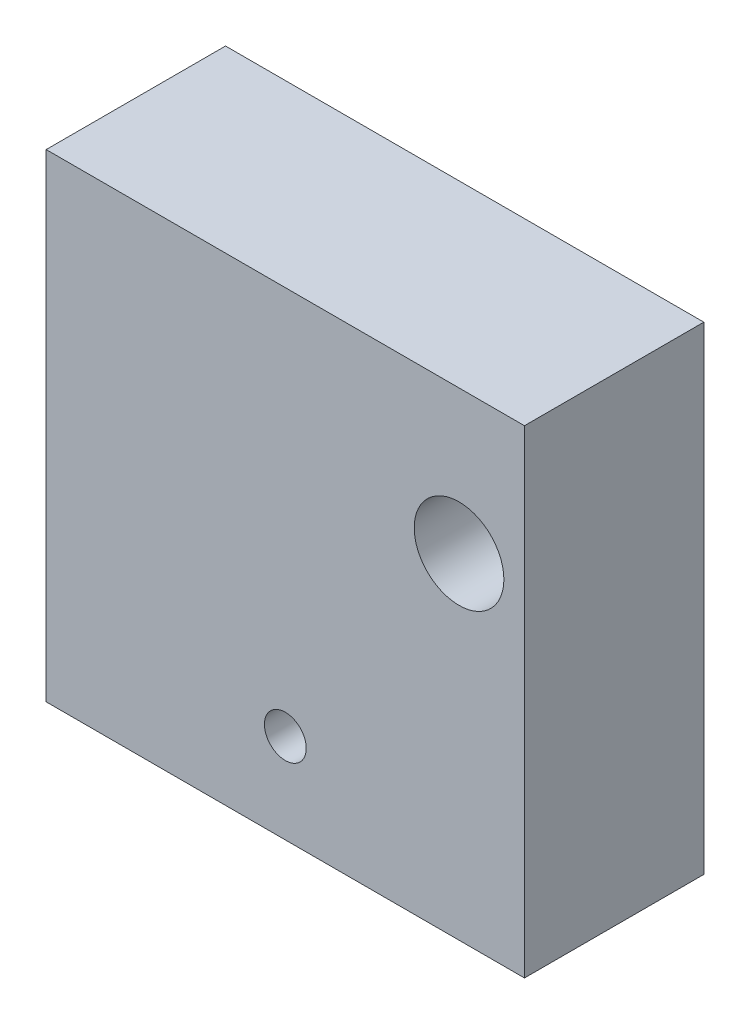
ISO-10303-21;
HEADER;
FILE_DESCRIPTION(('STEP AP214'),'2;1');
FILE_NAME('part.step','',(''),(''),'','','');
FILE_SCHEMA(('AUTOMOTIVE_DESIGN { 1 0 10303 214 1 1 1 1 }'));
ENDSEC;
DATA;
#1=APPLICATION_CONTEXT('core data for automotive mechanical design processes');
#2=APPLICATION_PROTOCOL_DEFINITION('international standard','automotive_design',2000,#1);
#3=PRODUCT_CONTEXT('',#1,'mechanical');
#4=PRODUCT('Part','Part','',(#3));
#5=PRODUCT_RELATED_PRODUCT_CATEGORY('part','',(#4));
#6=PRODUCT_DEFINITION_FORMATION('','',#4);
#7=PRODUCT_DEFINITION_CONTEXT('part definition',#1,'design');
#8=PRODUCT_DEFINITION('design','',#6,#7);
#9=PRODUCT_DEFINITION_SHAPE('','',#8);
#10=(LENGTH_UNIT() NAMED_UNIT(*) SI_UNIT(.MILLI.,.METRE.));
#11=(NAMED_UNIT(*) PLANE_ANGLE_UNIT() SI_UNIT($,.RADIAN.));
#12=(NAMED_UNIT(*) SI_UNIT($,.STERADIAN.) SOLID_ANGLE_UNIT());
#13=UNCERTAINTY_MEASURE_WITH_UNIT(LENGTH_MEASURE(1.E-05),#10,'distance_accuracy_value','');
#14=(GEOMETRIC_REPRESENTATION_CONTEXT(3) GLOBAL_UNCERTAINTY_ASSIGNED_CONTEXT((#13)) GLOBAL_UNIT_ASSIGNED_CONTEXT((#10,
#11,#12)) REPRESENTATION_CONTEXT('',''));
#15=CARTESIAN_POINT('',(0.,0.,0.));
#16=DIRECTION('',(0.,0.,1.));
#17=DIRECTION('',(1.,0.,0.));
#18=AXIS2_PLACEMENT_3D('',#15,#16,#17);
#19=CARTESIAN_POINT('',(40.,-40.,30.));
#20=DIRECTION('',(-1.,0.,0.));
#21=DIRECTION('',(0.,0.,1.));
#22=AXIS2_PLACEMENT_3D('',#19,#20,#21);
#23=PLANE('',#22);
#24=DIRECTION('',(0.,1.,0.));
#25=VECTOR('',#24,1.);
#26=CARTESIAN_POINT('',(40.,-40.,0.));
#27=LINE('',#26,#25);
#28=CARTESIAN_POINT('',(40.,-40.,0.));
#29=VERTEX_POINT('',#28);
#30=CARTESIAN_POINT('',(40.,40.,0.));
#31=VERTEX_POINT('',#30);
#32=EDGE_CURVE('E140',#29,#31,#27,.T.);
#33=ORIENTED_EDGE('',*,*,#32,.T.);
#34=DIRECTION('',(0.,0.,-1.));
#35=VECTOR('',#34,1.);
#36=CARTESIAN_POINT('',(40.,40.,30.));
#37=LINE('',#36,#35);
#38=CARTESIAN_POINT('',(40.,40.,30.));
#39=VERTEX_POINT('',#38);
#40=EDGE_CURVE('E11',#39,#31,#37,.T.);
#41=ORIENTED_EDGE('',*,*,#40,.F.);
#42=DIRECTION('',(0.,1.,0.));
#43=VECTOR('',#42,1.);
#44=CARTESIAN_POINT('',(40.,-40.,30.));
#45=LINE('',#44,#43);
#46=CARTESIAN_POINT('',(40.,-40.,30.));
#47=VERTEX_POINT('',#46);
#48=EDGE_CURVE('E144',#47,#39,#45,.T.);
#49=ORIENTED_EDGE('',*,*,#48,.F.);
#50=DIRECTION('',(0.,0.,-1.));
#51=VECTOR('',#50,1.);
#52=CARTESIAN_POINT('',(40.,-40.,30.));
#53=LINE('',#52,#51);
#54=EDGE_CURVE('E151',#47,#29,#53,.T.);
#55=ORIENTED_EDGE('',*,*,#54,.T.);
#56=EDGE_LOOP('',(#33,#41,#49,#55));
#57=FACE_BOUND('',#56,.T.);
#58=ADVANCED_FACE('F33',(#57),#23,.F.);
#59=CARTESIAN_POINT('',(-40.,40.,30.));
#60=DIRECTION('',(0.,-1.,0.));
#61=DIRECTION('',(0.,0.,-1.));
#62=AXIS2_PLACEMENT_3D('',#59,#60,#61);
#63=PLANE('',#62);
#64=DIRECTION('',(-1.,0.,0.));
#65=VECTOR('',#64,1.);
#66=CARTESIAN_POINT('',(-40.,40.,0.));
#67=LINE('',#66,#65);
#68=CARTESIAN_POINT('',(-40.,40.,0.));
#69=VERTEX_POINT('',#68);
#70=EDGE_CURVE('E154',#31,#69,#67,.T.);
#71=ORIENTED_EDGE('',*,*,#70,.T.);
#72=DIRECTION('',(0.,0.,-1.));
#73=VECTOR('',#72,1.);
#74=CARTESIAN_POINT('',(-40.,40.,30.));
#75=LINE('',#74,#73);
#76=CARTESIAN_POINT('',(-40.,40.,30.));
#77=VERTEX_POINT('',#76);
#78=EDGE_CURVE('E40',#77,#69,#75,.T.);
#79=ORIENTED_EDGE('',*,*,#78,.F.);
#80=DIRECTION('',(-1.,0.,0.));
#81=VECTOR('',#80,1.);
#82=CARTESIAN_POINT('',(-40.,40.,30.));
#83=LINE('',#82,#81);
#84=EDGE_CURVE('E84',#39,#77,#83,.T.);
#85=ORIENTED_EDGE('',*,*,#84,.F.);
#86=ORIENTED_EDGE('',*,*,#40,.T.);
#87=EDGE_LOOP('',(#71,#79,#85,#86));
#88=FACE_BOUND('',#87,.T.);
#89=ADVANCED_FACE('F191',(#88),#63,.F.);
#90=CARTESIAN_POINT('',(-40.,-40.,30.));
#91=DIRECTION('',(1.,0.,0.));
#92=DIRECTION('',(0.,0.,-1.));
#93=AXIS2_PLACEMENT_3D('',#90,#91,#92);
#94=PLANE('',#93);
#95=DIRECTION('',(0.,-1.,0.));
#96=VECTOR('',#95,1.);
#97=CARTESIAN_POINT('',(-40.,-40.,0.));
#98=LINE('',#97,#96);
#99=CARTESIAN_POINT('',(-40.,-40.,0.));
#100=VERTEX_POINT('',#99);
#101=EDGE_CURVE('E156',#69,#100,#98,.T.);
#102=ORIENTED_EDGE('',*,*,#101,.T.);
#103=DIRECTION('',(0.,0.,-1.));
#104=VECTOR('',#103,1.);
#105=CARTESIAN_POINT('',(-40.,-40.,30.));
#106=LINE('',#105,#104);
#107=CARTESIAN_POINT('',(-40.,-40.,30.));
#108=VERTEX_POINT('',#107);
#109=EDGE_CURVE('E160',#108,#100,#106,.T.);
#110=ORIENTED_EDGE('',*,*,#109,.F.);
#111=DIRECTION('',(0.,-1.,0.));
#112=VECTOR('',#111,1.);
#113=CARTESIAN_POINT('',(-40.,-40.,30.));
#114=LINE('',#113,#112);
#115=EDGE_CURVE('E148',#77,#108,#114,.T.);
#116=ORIENTED_EDGE('',*,*,#115,.F.);
#117=ORIENTED_EDGE('',*,*,#78,.T.);
#118=EDGE_LOOP('',(#102,#110,#116,#117));
#119=FACE_BOUND('',#118,.T.);
#120=ADVANCED_FACE('F166',(#119),#94,.F.);
#121=CARTESIAN_POINT('',(-40.,-40.,30.));
#122=DIRECTION('',(0.,1.,0.));
#123=DIRECTION('',(0.,0.,1.));
#124=AXIS2_PLACEMENT_3D('',#121,#122,#123);
#125=PLANE('',#124);
#126=DIRECTION('',(-1.,0.,0.));
#127=VECTOR('',#126,1.);
#128=CARTESIAN_POINT('',(20.,-40.,20.));
#129=LINE('',#128,#127);
#130=CARTESIAN_POINT('',(20.,-40.,20.));
#131=VERTEX_POINT('',#130);
#132=CARTESIAN_POINT('',(-20.,-40.,20.));
#133=VERTEX_POINT('',#132);
#134=EDGE_CURVE('E120',#131,#133,#129,.T.);
#135=ORIENTED_EDGE('',*,*,#134,.F.);
#136=DIRECTION('',(0.,0.,-1.));
#137=VECTOR('',#136,1.);
#138=CARTESIAN_POINT('',(20.,-40.,20.));
#139=LINE('',#138,#137);
#140=CARTESIAN_POINT('',(20.,-40.,0.));
#141=VERTEX_POINT('',#140);
#142=EDGE_CURVE('E106',#131,#141,#139,.T.);
#143=ORIENTED_EDGE('',*,*,#142,.T.);
#144=DIRECTION('',(1.,0.,0.));
#145=VECTOR('',#144,1.);
#146=CARTESIAN_POINT('',(-40.,-40.,0.));
#147=LINE('',#146,#145);
#148=EDGE_CURVE('E77',#141,#29,#147,.T.);
#149=ORIENTED_EDGE('',*,*,#148,.T.);
#150=ORIENTED_EDGE('',*,*,#54,.F.);
#151=DIRECTION('',(1.,0.,0.));
#152=VECTOR('',#151,1.);
#153=CARTESIAN_POINT('',(-40.,-40.,30.));
#154=LINE('',#153,#152);
#155=EDGE_CURVE('E56',#108,#47,#154,.T.);
#156=ORIENTED_EDGE('',*,*,#155,.F.);
#157=ORIENTED_EDGE('',*,*,#109,.T.);
#158=CARTESIAN_POINT('',(-20.,-40.,0.));
#159=VERTEX_POINT('',#158);
#160=EDGE_CURVE('E146',#100,#159,#147,.T.);
#161=ORIENTED_EDGE('',*,*,#160,.T.);
#162=DIRECTION('',(0.,0.,-1.));
#163=VECTOR('',#162,1.);
#164=CARTESIAN_POINT('',(-20.,-40.,20.));
#165=LINE('',#164,#163);
#166=EDGE_CURVE('E47',#133,#159,#165,.T.);
#167=ORIENTED_EDGE('',*,*,#166,.F.);
#168=EDGE_LOOP('',(#135,#143,#149,#150,#156,#157,#161,#167));
#169=FACE_BOUND('',#168,.T.);
#170=ADVANCED_FACE('F124',(#169),#125,.F.);
#171=CARTESIAN_POINT('',(0.,0.,30.));
#172=DIRECTION('',(0.,0.,-1.));
#173=DIRECTION('',(-1.,0.,0.));
#174=AXIS2_PLACEMENT_3D('',#171,#172,#173);
#175=PLANE('',#174);
#176=CARTESIAN_POINT('',(29.0563125975893,16.,30.));
#177=DIRECTION('',(0.,0.,1.));
#178=DIRECTION('',(1.,0.,0.));
#179=AXIS2_PLACEMENT_3D('',#176,#177,#178);
#180=CIRCLE('',#179,7.5);
#181=CARTESIAN_POINT('',(36.5563125975893,16.,30.));
#182=VERTEX_POINT('',#181);
#183=EDGE_CURVE('E269',#182,#182,#180,.T.);
#184=ORIENTED_EDGE('',*,*,#183,.F.);
#185=EDGE_LOOP('',(#184));
#186=FACE_BOUND('',#185,.T.);
#187=CARTESIAN_POINT('',(0.,-25.,30.));
#188=DIRECTION('',(0.,0.,-1.));
#189=DIRECTION('',(-1.,0.,0.));
#190=AXIS2_PLACEMENT_3D('',#187,#188,#189);
#191=CIRCLE('',#190,3.5);
#192=CARTESIAN_POINT('',(-3.49999999999999,-25.,30.));
#193=VERTEX_POINT('',#192);
#194=EDGE_CURVE('E134',#193,#193,#191,.T.);
#195=ORIENTED_EDGE('',*,*,#194,.T.);
#196=EDGE_LOOP('',(#195));
#197=FACE_BOUND('',#196,.T.);
#198=ORIENTED_EDGE('',*,*,#48,.T.);
#199=ORIENTED_EDGE('',*,*,#84,.T.);
#200=ORIENTED_EDGE('',*,*,#115,.T.);
#201=ORIENTED_EDGE('',*,*,#155,.T.);
#202=EDGE_LOOP('',(#198,#199,#200,#201));
#203=FACE_BOUND('',#202,.T.);
#204=ADVANCED_FACE('F176',(#186,#197,#203),#175,.F.);
#205=CARTESIAN_POINT('',(0.,0.,0.));
#206=DIRECTION('',(0.,0.,-1.));
#207=DIRECTION('',(-1.,0.,0.));
#208=AXIS2_PLACEMENT_3D('',#205,#206,#207);
#209=PLANE('',#208);
#210=CARTESIAN_POINT('',(29.0563125975893,16.,0.));
#211=DIRECTION('',(0.,0.,1.));
#212=DIRECTION('',(1.,0.,0.));
#213=AXIS2_PLACEMENT_3D('',#210,#211,#212);
#214=CIRCLE('',#213,7.5);
#215=CARTESIAN_POINT('',(36.5563125975893,16.,0.));
#216=VERTEX_POINT('',#215);
#217=EDGE_CURVE('E267',#216,#216,#214,.T.);
#218=ORIENTED_EDGE('',*,*,#217,.T.);
#219=EDGE_LOOP('',(#218));
#220=FACE_BOUND('',#219,.T.);
#221=DIRECTION('',(0.,-1.,0.));
#222=VECTOR('',#221,1.);
#223=CARTESIAN_POINT('',(20.,-40.,0.));
#224=LINE('',#223,#222);
#225=CARTESIAN_POINT('',(20.,-15.,0.));
#226=VERTEX_POINT('',#225);
#227=EDGE_CURVE('E112',#226,#141,#224,.T.);
#228=ORIENTED_EDGE('',*,*,#227,.F.);
#229=DIRECTION('',(1.,0.,0.));
#230=VECTOR('',#229,1.);
#231=CARTESIAN_POINT('',(20.,-15.,0.));
#232=LINE('',#231,#230);
#233=CARTESIAN_POINT('',(-20.,-15.,0.));
#234=VERTEX_POINT('',#233);
#235=EDGE_CURVE('E122',#234,#226,#232,.T.);
#236=ORIENTED_EDGE('',*,*,#235,.F.);
#237=DIRECTION('',(0.,1.,0.));
#238=VECTOR('',#237,1.);
#239=CARTESIAN_POINT('',(-20.,-40.,0.));
#240=LINE('',#239,#238);
#241=EDGE_CURVE('E133',#159,#234,#240,.T.);
#242=ORIENTED_EDGE('',*,*,#241,.F.);
#243=ORIENTED_EDGE('',*,*,#160,.F.);
#244=ORIENTED_EDGE('',*,*,#101,.F.);
#245=ORIENTED_EDGE('',*,*,#70,.F.);
#246=ORIENTED_EDGE('',*,*,#32,.F.);
#247=ORIENTED_EDGE('',*,*,#148,.F.);
#248=EDGE_LOOP('',(#228,#236,#242,#243,#244,#245,#246,#247));
#249=FACE_BOUND('',#248,.T.);
#250=ADVANCED_FACE('F170',(#220,#249),#209,.T.);
#251=CARTESIAN_POINT('',(20.,-40.,20.));
#252=DIRECTION('',(1.,0.,0.));
#253=DIRECTION('',(0.,1.,0.));
#254=AXIS2_PLACEMENT_3D('',#251,#252,#253);
#255=PLANE('',#254);
#256=ORIENTED_EDGE('',*,*,#227,.T.);
#257=ORIENTED_EDGE('',*,*,#142,.F.);
#258=DIRECTION('',(0.,-1.,0.));
#259=VECTOR('',#258,1.);
#260=CARTESIAN_POINT('',(20.,-40.,20.));
#261=LINE('',#260,#259);
#262=CARTESIAN_POINT('',(20.,-15.,20.));
#263=VERTEX_POINT('',#262);
#264=EDGE_CURVE('E109',#263,#131,#261,.T.);
#265=ORIENTED_EDGE('',*,*,#264,.F.);
#266=DIRECTION('',(0.,0.,-1.));
#267=VECTOR('',#266,1.);
#268=CARTESIAN_POINT('',(20.,-15.,20.));
#269=LINE('',#268,#267);
#270=EDGE_CURVE('E138',#263,#226,#269,.T.);
#271=ORIENTED_EDGE('',*,*,#270,.T.);
#272=EDGE_LOOP('',(#256,#257,#265,#271));
#273=FACE_BOUND('',#272,.T.);
#274=ADVANCED_FACE('F108',(#273),#255,.F.);
#275=CARTESIAN_POINT('',(20.,-15.,20.));
#276=DIRECTION('',(0.,1.,0.));
#277=DIRECTION('',(0.,0.,1.));
#278=AXIS2_PLACEMENT_3D('',#275,#276,#277);
#279=PLANE('',#278);
#280=ORIENTED_EDGE('',*,*,#235,.T.);
#281=ORIENTED_EDGE('',*,*,#270,.F.);
#282=DIRECTION('',(1.,0.,0.));
#283=VECTOR('',#282,1.);
#284=CARTESIAN_POINT('',(20.,-15.,20.));
#285=LINE('',#284,#283);
#286=CARTESIAN_POINT('',(-20.,-15.,20.));
#287=VERTEX_POINT('',#286);
#288=EDGE_CURVE('E114',#287,#263,#285,.T.);
#289=ORIENTED_EDGE('',*,*,#288,.F.);
#290=DIRECTION('',(0.,0.,-1.));
#291=VECTOR('',#290,1.);
#292=CARTESIAN_POINT('',(-20.,-15.,20.));
#293=LINE('',#292,#291);
#294=EDGE_CURVE('E141',#287,#234,#293,.T.);
#295=ORIENTED_EDGE('',*,*,#294,.T.);
#296=EDGE_LOOP('',(#280,#281,#289,#295));
#297=FACE_BOUND('',#296,.T.);
#298=ADVANCED_FACE('F200',(#297),#279,.F.);
#299=CARTESIAN_POINT('',(-20.,-40.,20.));
#300=DIRECTION('',(-1.,0.,0.));
#301=DIRECTION('',(0.,-1.,0.));
#302=AXIS2_PLACEMENT_3D('',#299,#300,#301);
#303=PLANE('',#302);
#304=ORIENTED_EDGE('',*,*,#241,.T.);
#305=ORIENTED_EDGE('',*,*,#294,.F.);
#306=DIRECTION('',(0.,1.,0.));
#307=VECTOR('',#306,1.);
#308=CARTESIAN_POINT('',(-20.,-40.,20.));
#309=LINE('',#308,#307);
#310=EDGE_CURVE('E126',#133,#287,#309,.T.);
#311=ORIENTED_EDGE('',*,*,#310,.F.);
#312=ORIENTED_EDGE('',*,*,#166,.T.);
#313=EDGE_LOOP('',(#304,#305,#311,#312));
#314=FACE_BOUND('',#313,.T.);
#315=ADVANCED_FACE('F201',(#314),#303,.F.);
#316=CARTESIAN_POINT('',(0.,0.,20.));
#317=DIRECTION('',(0.,0.,1.));
#318=DIRECTION('',(1.,0.,0.));
#319=AXIS2_PLACEMENT_3D('',#316,#317,#318);
#320=PLANE('',#319);
#321=CARTESIAN_POINT('',(0.,-25.,20.));
#322=DIRECTION('',(0.,0.,-1.));
#323=DIRECTION('',(-1.,0.,0.));
#324=AXIS2_PLACEMENT_3D('',#321,#322,#323);
#325=CIRCLE('',#324,3.5);
#326=CARTESIAN_POINT('',(-3.49999999999999,-25.,20.));
#327=VERTEX_POINT('',#326);
#328=EDGE_CURVE('E271',#327,#327,#325,.T.);
#329=ORIENTED_EDGE('',*,*,#328,.F.);
#330=EDGE_LOOP('',(#329));
#331=FACE_BOUND('',#330,.T.);
#332=ORIENTED_EDGE('',*,*,#264,.T.);
#333=ORIENTED_EDGE('',*,*,#134,.T.);
#334=ORIENTED_EDGE('',*,*,#310,.T.);
#335=ORIENTED_EDGE('',*,*,#288,.T.);
#336=EDGE_LOOP('',(#332,#333,#334,#335));
#337=FACE_BOUND('',#336,.T.);
#338=ADVANCED_FACE('F118',(#331,#337),#320,.F.);
#339=CARTESIAN_POINT('',(0.,-25.,30.));
#340=DIRECTION('',(0.,0.,-1.));
#341=DIRECTION('',(-1.,0.,0.));
#342=AXIS2_PLACEMENT_3D('',#339,#340,#341);
#343=CYLINDRICAL_SURFACE('',#342,3.5);
#344=ORIENTED_EDGE('',*,*,#194,.F.);
#345=EDGE_LOOP('',(#344));
#346=FACE_BOUND('',#345,.T.);
#347=ORIENTED_EDGE('',*,*,#328,.T.);
#348=EDGE_LOOP('',(#347));
#349=FACE_BOUND('',#348,.T.);
#350=ADVANCED_FACE('F208',(#346,#349),#343,.F.);
#351=CARTESIAN_POINT('',(29.0563125975893,16.,0.));
#352=DIRECTION('',(0.,0.,1.));
#353=DIRECTION('',(1.,0.,0.));
#354=AXIS2_PLACEMENT_3D('',#351,#352,#353);
#355=CYLINDRICAL_SURFACE('',#354,7.5);
#356=ORIENTED_EDGE('',*,*,#217,.F.);
#357=EDGE_LOOP('',(#356));
#358=FACE_BOUND('',#357,.T.);
#359=ORIENTED_EDGE('',*,*,#183,.T.);
#360=EDGE_LOOP('',(#359));
#361=FACE_BOUND('',#360,.T.);
#362=ADVANCED_FACE('F240',(#358,#361),#355,.F.);
#363=CLOSED_SHELL('',(#58,#89,#120,#170,#204,#250,#274,#298,#315,#338,#350,#362));
#364=MANIFOLD_SOLID_BREP('B2',#363);
#365=ADVANCED_BREP_SHAPE_REPRESENTATION('',(#18,#364),#14);
#366=SHAPE_DEFINITION_REPRESENTATION(#9,#365);
ENDSEC;
END-ISO-10303-21;
